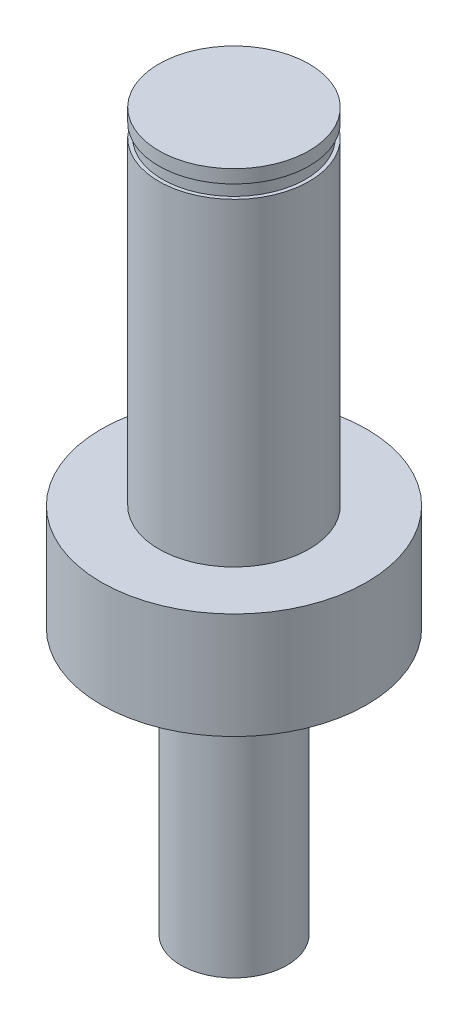
ISO-10303-21;
HEADER;
FILE_DESCRIPTION(('STEP AP214'),'2;1');
FILE_NAME('part.step','',(''),(''),'','','');
FILE_SCHEMA(('AUTOMOTIVE_DESIGN { 1 0 10303 214 1 1 1 1 }'));
ENDSEC;
DATA;
#1=APPLICATION_CONTEXT('core data for automotive mechanical design processes');
#2=APPLICATION_PROTOCOL_DEFINITION('international standard','automotive_design',2000,#1);
#3=PRODUCT_CONTEXT('',#1,'mechanical');
#4=PRODUCT('Part','Part','',(#3));
#5=PRODUCT_RELATED_PRODUCT_CATEGORY('part','',(#4));
#6=PRODUCT_DEFINITION_FORMATION('','',#4);
#7=PRODUCT_DEFINITION_CONTEXT('part definition',#1,'design');
#8=PRODUCT_DEFINITION('design','',#6,#7);
#9=PRODUCT_DEFINITION_SHAPE('','',#8);
#10=(LENGTH_UNIT() NAMED_UNIT(*) SI_UNIT(.MILLI.,.METRE.));
#11=(NAMED_UNIT(*) PLANE_ANGLE_UNIT() SI_UNIT($,.RADIAN.));
#12=(NAMED_UNIT(*) SI_UNIT($,.STERADIAN.) SOLID_ANGLE_UNIT());
#13=UNCERTAINTY_MEASURE_WITH_UNIT(LENGTH_MEASURE(1.E-05),#10,'distance_accuracy_value','');
#14=(GEOMETRIC_REPRESENTATION_CONTEXT(3) GLOBAL_UNCERTAINTY_ASSIGNED_CONTEXT((#13)) GLOBAL_UNIT_ASSIGNED_CONTEXT((#10,
#11,#12)) REPRESENTATION_CONTEXT('',''));
#15=CARTESIAN_POINT('',(0.,0.,0.));
#16=DIRECTION('',(0.,0.,1.));
#17=DIRECTION('',(1.,0.,0.));
#18=AXIS2_PLACEMENT_3D('',#15,#16,#17);
#19=CARTESIAN_POINT('',(0.,78.,0.));
#20=DIRECTION('',(0.,-1.,0.));
#21=DIRECTION('',(0.,0.,-1.));
#22=AXIS2_PLACEMENT_3D('',#19,#20,#21);
#23=PLANE('',#22);
#24=CARTESIAN_POINT('',(0.,78.,0.));
#25=DIRECTION('',(0.,-1.,0.));
#26=DIRECTION('',(0.,0.,-1.));
#27=AXIS2_PLACEMENT_3D('',#24,#25,#26);
#28=CIRCLE('',#27,8.5);
#29=CARTESIAN_POINT('',(0.,78.,-8.5));
#30=VERTEX_POINT('',#29);
#31=EDGE_CURVE('E80',#30,#30,#28,.T.);
#32=ORIENTED_EDGE('',*,*,#31,.F.);
#33=EDGE_LOOP('',(#32));
#34=FACE_BOUND('',#33,.T.);
#35=CARTESIAN_POINT('',(0.,78.,0.));
#36=DIRECTION('',(0.,-1.,0.));
#37=DIRECTION('',(0.,0.,-1.));
#38=AXIS2_PLACEMENT_3D('',#35,#36,#37);
#39=CIRCLE('',#38,8.1);
#40=CARTESIAN_POINT('',(0.,78.,-8.1));
#41=VERTEX_POINT('',#40);
#42=EDGE_CURVE('E10',#41,#41,#39,.T.);
#43=ORIENTED_EDGE('',*,*,#42,.T.);
#44=EDGE_LOOP('',(#43));
#45=FACE_BOUND('',#44,.T.);
#46=ADVANCED_FACE('F35',(#34,#45),#23,.F.);
#47=CARTESIAN_POINT('',(0.,0.,0.));
#48=DIRECTION('',(0.,-1.,0.));
#49=DIRECTION('',(0.,0.,-1.));
#50=AXIS2_PLACEMENT_3D('',#47,#48,#49);
#51=CYLINDRICAL_SURFACE('',#50,8.1);
#52=ORIENTED_EDGE('',*,*,#42,.F.);
#53=EDGE_LOOP('',(#52));
#54=FACE_BOUND('',#53,.T.);
#55=CARTESIAN_POINT('',(0.,79.5,0.));
#56=DIRECTION('',(0.,-1.,0.));
#57=DIRECTION('',(0.,0.,-1.));
#58=AXIS2_PLACEMENT_3D('',#55,#56,#57);
#59=CIRCLE('',#58,8.1);
#60=CARTESIAN_POINT('',(0.,79.5,-8.1));
#61=VERTEX_POINT('',#60);
#62=EDGE_CURVE('E42',#61,#61,#59,.T.);
#63=ORIENTED_EDGE('',*,*,#62,.T.);
#64=EDGE_LOOP('',(#63));
#65=FACE_BOUND('',#64,.T.);
#66=ADVANCED_FACE('F90',(#54,#65),#51,.T.);
#67=CARTESIAN_POINT('',(0.,79.5,0.));
#68=DIRECTION('',(0.,1.,0.));
#69=DIRECTION('',(0.,0.,1.));
#70=AXIS2_PLACEMENT_3D('',#67,#68,#69);
#71=PLANE('',#70);
#72=ORIENTED_EDGE('',*,*,#62,.F.);
#73=EDGE_LOOP('',(#72));
#74=FACE_BOUND('',#73,.T.);
#75=CARTESIAN_POINT('',(0.,79.5,0.));
#76=DIRECTION('',(0.,-1.,0.));
#77=DIRECTION('',(0.,0.,-1.));
#78=AXIS2_PLACEMENT_3D('',#75,#76,#77);
#79=CIRCLE('',#78,8.5);
#80=CARTESIAN_POINT('',(0.,79.5,-8.5));
#81=VERTEX_POINT('',#80);
#82=EDGE_CURVE('E48',#81,#81,#79,.T.);
#83=ORIENTED_EDGE('',*,*,#82,.T.);
#84=EDGE_LOOP('',(#83));
#85=FACE_BOUND('',#84,.T.);
#86=ADVANCED_FACE('F94',(#74,#85),#71,.F.);
#87=CARTESIAN_POINT('',(0.,0.,0.));
#88=DIRECTION('',(0.,-1.,0.));
#89=DIRECTION('',(0.,0.,-1.));
#90=AXIS2_PLACEMENT_3D('',#87,#88,#89);
#91=CYLINDRICAL_SURFACE('',#90,8.5);
#92=CARTESIAN_POINT('',(0.,81.,0.));
#93=DIRECTION('',(0.,-1.,0.));
#94=DIRECTION('',(0.,0.,-1.));
#95=AXIS2_PLACEMENT_3D('',#92,#93,#94);
#96=CIRCLE('',#95,8.5);
#97=CARTESIAN_POINT('',(0.,81.,-8.5));
#98=VERTEX_POINT('',#97);
#99=EDGE_CURVE('E54',#98,#98,#96,.T.);
#100=ORIENTED_EDGE('',*,*,#99,.T.);
#101=EDGE_LOOP('',(#100));
#102=FACE_BOUND('',#101,.T.);
#103=ORIENTED_EDGE('',*,*,#82,.F.);
#104=EDGE_LOOP('',(#103));
#105=FACE_BOUND('',#104,.T.);
#106=ADVANCED_FACE('F99',(#102,#105),#91,.T.);
#107=CARTESIAN_POINT('',(0.,81.,0.));
#108=DIRECTION('',(0.,1.,0.));
#109=DIRECTION('',(0.,0.,1.));
#110=AXIS2_PLACEMENT_3D('',#107,#108,#109);
#111=PLANE('',#110);
#112=ORIENTED_EDGE('',*,*,#99,.F.);
#113=EDGE_LOOP('',(#112));
#114=FACE_BOUND('',#113,.T.);
#115=ADVANCED_FACE('F103',(#114),#111,.T.);
#116=CARTESIAN_POINT('',(0.,0.,0.));
#117=DIRECTION('',(0.,-1.,0.));
#118=DIRECTION('',(0.,0.,-1.));
#119=AXIS2_PLACEMENT_3D('',#116,#117,#118);
#120=PLANE('',#119);
#121=CARTESIAN_POINT('',(0.,0.,0.));
#122=DIRECTION('',(0.,-1.,0.));
#123=DIRECTION('',(0.,0.,-1.));
#124=AXIS2_PLACEMENT_3D('',#121,#122,#123);
#125=CIRCLE('',#124,6.);
#126=CARTESIAN_POINT('',(0.,0.,-6.));
#127=VERTEX_POINT('',#126);
#128=EDGE_CURVE('E60',#127,#127,#125,.T.);
#129=ORIENTED_EDGE('',*,*,#128,.T.);
#130=EDGE_LOOP('',(#129));
#131=FACE_BOUND('',#130,.T.);
#132=ADVANCED_FACE('F106',(#131),#120,.T.);
#133=CARTESIAN_POINT('',(0.,0.,0.));
#134=DIRECTION('',(0.,-1.,0.));
#135=DIRECTION('',(0.,0.,-1.));
#136=AXIS2_PLACEMENT_3D('',#133,#134,#135);
#137=CYLINDRICAL_SURFACE('',#136,6.);
#138=CARTESIAN_POINT('',(0.,30.,0.));
#139=DIRECTION('',(0.,-1.,0.));
#140=DIRECTION('',(0.,0.,-1.));
#141=AXIS2_PLACEMENT_3D('',#138,#139,#140);
#142=CIRCLE('',#141,6.);
#143=CARTESIAN_POINT('',(0.,30.,-6.));
#144=VERTEX_POINT('',#143);
#145=EDGE_CURVE('E64',#144,#144,#142,.T.);
#146=ORIENTED_EDGE('',*,*,#145,.T.);
#147=EDGE_LOOP('',(#146));
#148=FACE_BOUND('',#147,.T.);
#149=ORIENTED_EDGE('',*,*,#128,.F.);
#150=EDGE_LOOP('',(#149));
#151=FACE_BOUND('',#150,.T.);
#152=ADVANCED_FACE('F110',(#148,#151),#137,.T.);
#153=CARTESIAN_POINT('',(0.,30.,0.));
#154=DIRECTION('',(0.,-1.,0.));
#155=DIRECTION('',(0.,0.,-1.));
#156=AXIS2_PLACEMENT_3D('',#153,#154,#155);
#157=PLANE('',#156);
#158=CARTESIAN_POINT('',(0.,30.,0.));
#159=DIRECTION('',(0.,-1.,0.));
#160=DIRECTION('',(0.,0.,-1.));
#161=AXIS2_PLACEMENT_3D('',#158,#159,#160);
#162=CIRCLE('',#161,15.);
#163=CARTESIAN_POINT('',(0.,30.,-15.));
#164=VERTEX_POINT('',#163);
#165=EDGE_CURVE('E68',#164,#164,#162,.T.);
#166=ORIENTED_EDGE('',*,*,#165,.T.);
#167=EDGE_LOOP('',(#166));
#168=FACE_BOUND('',#167,.T.);
#169=ORIENTED_EDGE('',*,*,#145,.F.);
#170=EDGE_LOOP('',(#169));
#171=FACE_BOUND('',#170,.T.);
#172=ADVANCED_FACE('F114',(#168,#171),#157,.T.);
#173=CARTESIAN_POINT('',(0.,0.,0.));
#174=DIRECTION('',(0.,-1.,0.));
#175=DIRECTION('',(0.,0.,-1.));
#176=AXIS2_PLACEMENT_3D('',#173,#174,#175);
#177=CYLINDRICAL_SURFACE('',#176,15.);
#178=CARTESIAN_POINT('',(0.,42.,0.));
#179=DIRECTION('',(0.,-1.,0.));
#180=DIRECTION('',(0.,0.,-1.));
#181=AXIS2_PLACEMENT_3D('',#178,#179,#180);
#182=CIRCLE('',#181,15.);
#183=CARTESIAN_POINT('',(0.,42.,-15.));
#184=VERTEX_POINT('',#183);
#185=EDGE_CURVE('E72',#184,#184,#182,.T.);
#186=ORIENTED_EDGE('',*,*,#185,.T.);
#187=EDGE_LOOP('',(#186));
#188=FACE_BOUND('',#187,.T.);
#189=ORIENTED_EDGE('',*,*,#165,.F.);
#190=EDGE_LOOP('',(#189));
#191=FACE_BOUND('',#190,.T.);
#192=ADVANCED_FACE('F118',(#188,#191),#177,.T.);
#193=CARTESIAN_POINT('',(0.,42.,0.));
#194=DIRECTION('',(0.,1.,0.));
#195=DIRECTION('',(0.,0.,1.));
#196=AXIS2_PLACEMENT_3D('',#193,#194,#195);
#197=PLANE('',#196);
#198=CARTESIAN_POINT('',(0.,42.,0.));
#199=DIRECTION('',(0.,-1.,0.));
#200=DIRECTION('',(0.,0.,-1.));
#201=AXIS2_PLACEMENT_3D('',#198,#199,#200);
#202=CIRCLE('',#201,8.5);
#203=CARTESIAN_POINT('',(0.,42.,-8.5));
#204=VERTEX_POINT('',#203);
#205=EDGE_CURVE('E76',#204,#204,#202,.T.);
#206=ORIENTED_EDGE('',*,*,#205,.T.);
#207=EDGE_LOOP('',(#206));
#208=FACE_BOUND('',#207,.T.);
#209=ORIENTED_EDGE('',*,*,#185,.F.);
#210=EDGE_LOOP('',(#209));
#211=FACE_BOUND('',#210,.T.);
#212=ADVANCED_FACE('F122',(#208,#211),#197,.T.);
#213=ORIENTED_EDGE('',*,*,#31,.T.);
#214=EDGE_LOOP('',(#213));
#215=FACE_BOUND('',#214,.T.);
#216=ORIENTED_EDGE('',*,*,#205,.F.);
#217=EDGE_LOOP('',(#216));
#218=FACE_BOUND('',#217,.T.);
#219=ADVANCED_FACE('F86',(#215,#218),#91,.T.);
#220=CLOSED_SHELL('',(#46,#66,#86,#106,#115,#132,#152,#172,#192,#212,#219));
#221=MANIFOLD_SOLID_BREP('B2',#220);
#222=ADVANCED_BREP_SHAPE_REPRESENTATION('',(#18,#221),#14);
#223=SHAPE_DEFINITION_REPRESENTATION(#9,#222);
ENDSEC;
END-ISO-10303-21;
